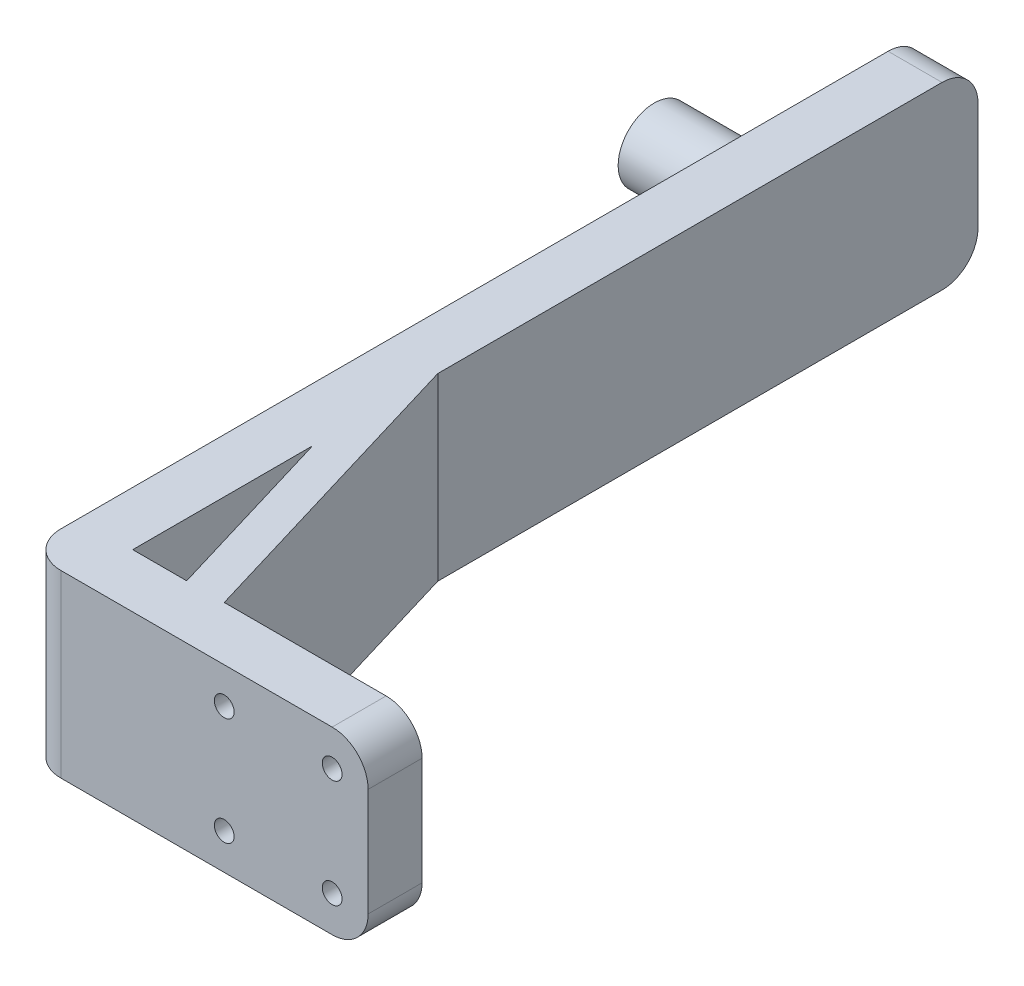
ISO-10303-21;
HEADER;
FILE_DESCRIPTION(('STEP AP214'),'2;1');
FILE_NAME('part.step','',(''),(''),'','','');
FILE_SCHEMA(('AUTOMOTIVE_DESIGN { 1 0 10303 214 1 1 1 1 }'));
ENDSEC;
DATA;
#1=APPLICATION_CONTEXT('core data for automotive mechanical design processes');
#2=APPLICATION_PROTOCOL_DEFINITION('international standard','automotive_design',2000,#1);
#3=PRODUCT_CONTEXT('',#1,'mechanical');
#4=PRODUCT('Part','Part','',(#3));
#5=PRODUCT_RELATED_PRODUCT_CATEGORY('part','',(#4));
#6=PRODUCT_DEFINITION_FORMATION('','',#4);
#7=PRODUCT_DEFINITION_CONTEXT('part definition',#1,'design');
#8=PRODUCT_DEFINITION('design','',#6,#7);
#9=PRODUCT_DEFINITION_SHAPE('','',#8);
#10=(LENGTH_UNIT() NAMED_UNIT(*) SI_UNIT(.MILLI.,.METRE.));
#11=(NAMED_UNIT(*) PLANE_ANGLE_UNIT() SI_UNIT($,.RADIAN.));
#12=(NAMED_UNIT(*) SI_UNIT($,.STERADIAN.) SOLID_ANGLE_UNIT());
#13=UNCERTAINTY_MEASURE_WITH_UNIT(LENGTH_MEASURE(1.E-05),#10,'distance_accuracy_value','');
#14=(GEOMETRIC_REPRESENTATION_CONTEXT(3) GLOBAL_UNCERTAINTY_ASSIGNED_CONTEXT((#13)) GLOBAL_UNIT_ASSIGNED_CONTEXT((#10,
#11,#12)) REPRESENTATION_CONTEXT('',''));
#15=CARTESIAN_POINT('',(0.,0.,0.));
#16=DIRECTION('',(0.,0.,1.));
#17=DIRECTION('',(1.,0.,0.));
#18=AXIS2_PLACEMENT_3D('',#15,#16,#17);
#19=CARTESIAN_POINT('',(15.,50.,0.));
#20=DIRECTION('',(-1.,0.,0.));
#21=DIRECTION('',(0.,0.,1.));
#22=AXIS2_PLACEMENT_3D('',#19,#20,#21);
#23=PLANE('',#22);
#24=DIRECTION('',(0.,0.,-1.));
#25=VECTOR('',#24,1.);
#26=CARTESIAN_POINT('',(15.,0.,0.));
#27=LINE('',#26,#25);
#28=CARTESIAN_POINT('',(15.,0.,-15.));
#29=VERTEX_POINT('',#28);
#30=CARTESIAN_POINT('',(15.,0.,-65.));
#31=VERTEX_POINT('',#30);
#32=EDGE_CURVE('E262',#29,#31,#27,.T.);
#33=ORIENTED_EDGE('',*,*,#32,.T.);
#34=DIRECTION('',(0.,-1.,0.));
#35=VECTOR('',#34,1.);
#36=CARTESIAN_POINT('',(15.,50.,-65.));
#37=LINE('',#36,#35);
#38=CARTESIAN_POINT('',(15.,50.,-65.));
#39=VERTEX_POINT('',#38);
#40=EDGE_CURVE('E190',#39,#31,#37,.T.);
#41=ORIENTED_EDGE('',*,*,#40,.F.);
#42=DIRECTION('',(0.,0.,-1.));
#43=VECTOR('',#42,1.);
#44=CARTESIAN_POINT('',(15.,50.,0.));
#45=LINE('',#44,#43);
#46=CARTESIAN_POINT('',(15.,50.,-15.));
#47=VERTEX_POINT('',#46);
#48=EDGE_CURVE('E160',#47,#39,#45,.T.);
#49=ORIENTED_EDGE('',*,*,#48,.F.);
#50=DIRECTION('',(0.,-1.,0.));
#51=VECTOR('',#50,1.);
#52=CARTESIAN_POINT('',(15.,50.,-15.));
#53=LINE('',#52,#51);
#54=EDGE_CURVE('E176',#47,#29,#53,.T.);
#55=ORIENTED_EDGE('',*,*,#54,.T.);
#56=EDGE_LOOP('',(#33,#41,#49,#55));
#57=FACE_BOUND('',#56,.T.);
#58=ADVANCED_FACE('F41',(#57),#23,.F.);
#59=CARTESIAN_POINT('',(31.651376146789,50.,-9.4954128440367));
#60=DIRECTION('',(0.957826285221152,0.,-0.287347885566345));
#61=DIRECTION('',(-0.287347885566345,0.,-0.957826285221152));
#62=AXIS2_PLACEMENT_3D('',#59,#60,#61);
#63=PLANE('',#62);
#64=DIRECTION('',(0.287347885566345,0.,0.957826285221151));
#65=VECTOR('',#64,1.);
#66=CARTESIAN_POINT('',(31.651376146789,0.,-9.4954128440367));
#67=LINE('',#66,#65);
#68=CARTESIAN_POINT('',(30.,0.,-15.));
#69=VERTEX_POINT('',#68);
#70=EDGE_CURVE('E268',#31,#69,#67,.T.);
#71=ORIENTED_EDGE('',*,*,#70,.T.);
#72=DIRECTION('',(0.,-1.,0.));
#73=VECTOR('',#72,1.);
#74=CARTESIAN_POINT('',(30.,50.,-15.));
#75=LINE('',#74,#73);
#76=CARTESIAN_POINT('',(30.,50.,-15.));
#77=VERTEX_POINT('',#76);
#78=EDGE_CURVE('E180',#77,#69,#75,.T.);
#79=ORIENTED_EDGE('',*,*,#78,.F.);
#80=DIRECTION('',(0.287347885566345,0.,0.957826285221151));
#81=VECTOR('',#80,1.);
#82=CARTESIAN_POINT('',(31.651376146789,50.,-9.4954128440367));
#83=LINE('',#82,#81);
#84=EDGE_CURVE('E258',#39,#77,#83,.T.);
#85=ORIENTED_EDGE('',*,*,#84,.F.);
#86=ORIENTED_EDGE('',*,*,#40,.T.);
#87=EDGE_LOOP('',(#71,#79,#85,#86));
#88=FACE_BOUND('',#87,.T.);
#89=ADVANCED_FACE('F312',(#88),#63,.F.);
#90=CARTESIAN_POINT('',(41.2296389990005,50.,-12.3688916997002));
#91=DIRECTION('',(-0.957826285221151,0.,0.287347885566345));
#92=DIRECTION('',(0.287347885566346,0.,0.957826285221152));
#93=AXIS2_PLACEMENT_3D('',#90,#91,#92);
#94=PLANE('',#93);
#95=DIRECTION('',(-0.287347885566346,0.,-0.957826285221151));
#96=VECTOR('',#95,1.);
#97=CARTESIAN_POINT('',(41.2296389990005,0.,-12.3688916997002));
#98=LINE('',#97,#96);
#99=CARTESIAN_POINT('',(40.4403065089105,0.,-15.));
#100=VERTEX_POINT('',#99);
#101=CARTESIAN_POINT('',(15.,0.,-99.8010216963685));
#102=VERTEX_POINT('',#101);
#103=EDGE_CURVE('E175',#100,#102,#98,.T.);
#104=ORIENTED_EDGE('',*,*,#103,.T.);
#105=DIRECTION('',(0.,-1.,0.));
#106=VECTOR('',#105,1.);
#107=CARTESIAN_POINT('',(15.,50.,-99.8010216963685));
#108=LINE('',#107,#106);
#109=CARTESIAN_POINT('',(15.,50.,-99.8010216963685));
#110=VERTEX_POINT('',#109);
#111=EDGE_CURVE('E151',#110,#102,#108,.T.);
#112=ORIENTED_EDGE('',*,*,#111,.F.);
#113=DIRECTION('',(-0.287347885566346,0.,-0.957826285221151));
#114=VECTOR('',#113,1.);
#115=CARTESIAN_POINT('',(41.2296389990005,50.,-12.3688916997002));
#116=LINE('',#115,#114);
#117=CARTESIAN_POINT('',(40.4403065089105,50.,-15.));
#118=VERTEX_POINT('',#117);
#119=EDGE_CURVE('E158',#118,#110,#116,.T.);
#120=ORIENTED_EDGE('',*,*,#119,.F.);
#121=DIRECTION('',(0.,-1.,0.));
#122=VECTOR('',#121,1.);
#123=CARTESIAN_POINT('',(40.4403065089105,50.,-15.));
#124=LINE('',#123,#122);
#125=EDGE_CURVE('E274',#118,#100,#124,.T.);
#126=ORIENTED_EDGE('',*,*,#125,.T.);
#127=EDGE_LOOP('',(#104,#112,#120,#126));
#128=FACE_BOUND('',#127,.T.);
#129=ADVANCED_FACE('F173',(#128),#94,.F.);
#130=CARTESIAN_POINT('',(15.,0.,-240.));
#131=VERTEX_POINT('',#130);
#132=EDGE_CURVE('E245',#102,#131,#27,.T.);
#133=ORIENTED_EDGE('',*,*,#132,.T.);
#134=CARTESIAN_POINT('',(15.,10.,-240.));
#135=DIRECTION('',(-1.,0.,0.));
#136=DIRECTION('',(0.,0.,1.));
#137=AXIS2_PLACEMENT_3D('',#134,#135,#136);
#138=CIRCLE('',#137,10.);
#139=CARTESIAN_POINT('',(15.,10.,-250.));
#140=VERTEX_POINT('',#139);
#141=EDGE_CURVE('E11',#131,#140,#138,.F.);
#142=ORIENTED_EDGE('',*,*,#141,.T.);
#143=DIRECTION('',(0.,-1.,0.));
#144=VECTOR('',#143,1.);
#145=CARTESIAN_POINT('',(15.,50.,-250.));
#146=LINE('',#145,#144);
#147=CARTESIAN_POINT('',(15.,40.,-250.));
#148=VERTEX_POINT('',#147);
#149=EDGE_CURVE('E177',#148,#140,#146,.T.);
#150=ORIENTED_EDGE('',*,*,#149,.F.);
#151=CARTESIAN_POINT('',(15.,40.,-240.));
#152=DIRECTION('',(-1.,0.,0.));
#153=DIRECTION('',(0.,0.,1.));
#154=AXIS2_PLACEMENT_3D('',#151,#152,#153);
#155=CIRCLE('',#154,10.);
#156=CARTESIAN_POINT('',(15.,50.,-240.));
#157=VERTEX_POINT('',#156);
#158=EDGE_CURVE('E49',#148,#157,#155,.F.);
#159=ORIENTED_EDGE('',*,*,#158,.T.);
#160=EDGE_CURVE('E147',#110,#157,#45,.T.);
#161=ORIENTED_EDGE('',*,*,#160,.F.);
#162=ORIENTED_EDGE('',*,*,#111,.T.);
#163=EDGE_LOOP('',(#133,#142,#150,#159,#161,#162));
#164=FACE_BOUND('',#163,.T.);
#165=ADVANCED_FACE('F149',(#164),#23,.F.);
#166=CARTESIAN_POINT('',(0.,50.,-250.));
#167=DIRECTION('',(0.,0.,1.));
#168=DIRECTION('',(1.,0.,0.));
#169=AXIS2_PLACEMENT_3D('',#166,#167,#168);
#170=PLANE('',#169);
#171=ORIENTED_EDGE('',*,*,#149,.T.);
#172=DIRECTION('',(-1.,0.,0.));
#173=VECTOR('',#172,1.);
#174=CARTESIAN_POINT('',(0.,10.,-250.));
#175=LINE('',#174,#173);
#176=CARTESIAN_POINT('',(0.,10.,-250.));
#177=VERTEX_POINT('',#176);
#178=EDGE_CURVE('E224',#140,#177,#175,.T.);
#179=ORIENTED_EDGE('',*,*,#178,.T.);
#180=DIRECTION('',(0.,-1.,0.));
#181=VECTOR('',#180,1.);
#182=CARTESIAN_POINT('',(0.,50.,-250.));
#183=LINE('',#182,#181);
#184=CARTESIAN_POINT('',(0.,40.,-250.));
#185=VERTEX_POINT('',#184);
#186=EDGE_CURVE('E182',#185,#177,#183,.T.);
#187=ORIENTED_EDGE('',*,*,#186,.F.);
#188=DIRECTION('',(-1.,0.,0.));
#189=VECTOR('',#188,1.);
#190=CARTESIAN_POINT('',(15.,40.,-250.));
#191=LINE('',#190,#189);
#192=EDGE_CURVE('E61',#185,#148,#191,.F.);
#193=ORIENTED_EDGE('',*,*,#192,.T.);
#194=EDGE_LOOP('',(#171,#179,#187,#193));
#195=FACE_BOUND('',#194,.T.);
#196=ADVANCED_FACE('F248',(#195),#170,.F.);
#197=CARTESIAN_POINT('',(0.,50.,0.));
#198=DIRECTION('',(1.,0.,0.));
#199=DIRECTION('',(0.,0.,-1.));
#200=AXIS2_PLACEMENT_3D('',#197,#198,#199);
#201=PLANE('',#200);
#202=CARTESIAN_POINT('',(0.,25.,-210.));
#203=DIRECTION('',(1.,0.,0.));
#204=DIRECTION('',(0.,0.,-1.));
#205=AXIS2_PLACEMENT_3D('',#202,#203,#204);
#206=CIRCLE('',#205,12.5);
#207=CARTESIAN_POINT('',(0.,25.,-222.5));
#208=VERTEX_POINT('',#207);
#209=EDGE_CURVE('E198',#208,#208,#206,.F.);
#210=ORIENTED_EDGE('',*,*,#209,.F.);
#211=EDGE_LOOP('',(#210));
#212=FACE_BOUND('',#211,.T.);
#213=ORIENTED_EDGE('',*,*,#186,.T.);
#214=CARTESIAN_POINT('',(0.,10.,-240.));
#215=DIRECTION('',(1.,0.,0.));
#216=DIRECTION('',(0.,0.,-1.));
#217=AXIS2_PLACEMENT_3D('',#214,#215,#216);
#218=CIRCLE('',#217,10.);
#219=CARTESIAN_POINT('',(0.,0.,-240.));
#220=VERTEX_POINT('',#219);
#221=EDGE_CURVE('E229',#177,#220,#218,.F.);
#222=ORIENTED_EDGE('',*,*,#221,.T.);
#223=DIRECTION('',(0.,0.,1.));
#224=VECTOR('',#223,1.);
#225=CARTESIAN_POINT('',(0.,0.,0.));
#226=LINE('',#225,#224);
#227=CARTESIAN_POINT('',(0.,0.,-10.));
#228=VERTEX_POINT('',#227);
#229=EDGE_CURVE('E234',#220,#228,#226,.T.);
#230=ORIENTED_EDGE('',*,*,#229,.T.);
#231=DIRECTION('',(0.,-1.,0.));
#232=VECTOR('',#231,1.);
#233=CARTESIAN_POINT('',(0.,50.,-10.));
#234=LINE('',#233,#232);
#235=CARTESIAN_POINT('',(0.,50.,-10.));
#236=VERTEX_POINT('',#235);
#237=EDGE_CURVE('E193',#228,#236,#234,.F.);
#238=ORIENTED_EDGE('',*,*,#237,.T.);
#239=DIRECTION('',(0.,0.,1.));
#240=VECTOR('',#239,1.);
#241=CARTESIAN_POINT('',(0.,50.,0.));
#242=LINE('',#241,#240);
#243=CARTESIAN_POINT('',(0.,50.,-240.));
#244=VERTEX_POINT('',#243);
#245=EDGE_CURVE('E157',#244,#236,#242,.T.);
#246=ORIENTED_EDGE('',*,*,#245,.F.);
#247=CARTESIAN_POINT('',(0.,40.,-240.));
#248=DIRECTION('',(1.,0.,0.));
#249=DIRECTION('',(0.,0.,-1.));
#250=AXIS2_PLACEMENT_3D('',#247,#248,#249);
#251=CIRCLE('',#250,10.);
#252=EDGE_CURVE('E227',#244,#185,#251,.F.);
#253=ORIENTED_EDGE('',*,*,#252,.T.);
#254=EDGE_LOOP('',(#213,#222,#230,#238,#246,#253));
#255=FACE_BOUND('',#254,.T.);
#256=ADVANCED_FACE('F233',(#212,#255),#201,.F.);
#257=CARTESIAN_POINT('',(0.,50.,0.));
#258=DIRECTION('',(0.,0.,-1.));
#259=DIRECTION('',(-1.,0.,0.));
#260=AXIS2_PLACEMENT_3D('',#257,#258,#259);
#261=PLANE('',#260);
#262=CARTESIAN_POINT('',(85.4403065089106,40.,0.));
#263=DIRECTION('',(0.,0.,-1.));
#264=DIRECTION('',(-1.,0.,0.));
#265=AXIS2_PLACEMENT_3D('',#262,#263,#264);
#266=CIRCLE('',#265,2.74999999999999);
#267=CARTESIAN_POINT('',(82.6903065089106,40.,0.));
#268=VERTEX_POINT('',#267);
#269=EDGE_CURVE('E457',#268,#268,#266,.T.);
#270=ORIENTED_EDGE('',*,*,#269,.T.);
#271=EDGE_LOOP('',(#270));
#272=FACE_BOUND('',#271,.T.);
#273=CARTESIAN_POINT('',(55.4403065089106,10.,0.));
#274=DIRECTION('',(0.,0.,-1.));
#275=DIRECTION('',(-1.,0.,0.));
#276=AXIS2_PLACEMENT_3D('',#273,#274,#275);
#277=CIRCLE('',#276,2.74999999999999);
#278=CARTESIAN_POINT('',(52.6903065089106,10.,0.));
#279=VERTEX_POINT('',#278);
#280=EDGE_CURVE('E464',#279,#279,#277,.T.);
#281=ORIENTED_EDGE('',*,*,#280,.T.);
#282=EDGE_LOOP('',(#281));
#283=FACE_BOUND('',#282,.T.);
#284=CARTESIAN_POINT('',(85.4403065089106,10.,0.));
#285=DIRECTION('',(0.,0.,-1.));
#286=DIRECTION('',(-1.,0.,0.));
#287=AXIS2_PLACEMENT_3D('',#284,#285,#286);
#288=CIRCLE('',#287,2.74999999999999);
#289=CARTESIAN_POINT('',(82.6903065089106,10.,0.));
#290=VERTEX_POINT('',#289);
#291=EDGE_CURVE('E384',#290,#290,#288,.T.);
#292=ORIENTED_EDGE('',*,*,#291,.T.);
#293=EDGE_LOOP('',(#292));
#294=FACE_BOUND('',#293,.T.);
#295=CARTESIAN_POINT('',(55.4403065089106,40.,0.));
#296=DIRECTION('',(0.,0.,-1.));
#297=DIRECTION('',(-1.,0.,0.));
#298=AXIS2_PLACEMENT_3D('',#295,#296,#297);
#299=CIRCLE('',#298,2.74999999999999);
#300=CARTESIAN_POINT('',(52.6903065089106,40.,0.));
#301=VERTEX_POINT('',#300);
#302=EDGE_CURVE('E261',#301,#301,#299,.T.);
#303=ORIENTED_EDGE('',*,*,#302,.T.);
#304=EDGE_LOOP('',(#303));
#305=FACE_BOUND('',#304,.T.);
#306=DIRECTION('',(1.,0.,0.));
#307=VECTOR('',#306,1.);
#308=CARTESIAN_POINT('',(0.,0.,0.));
#309=LINE('',#308,#307);
#310=CARTESIAN_POINT('',(10.,0.,0.));
#311=VERTEX_POINT('',#310);
#312=CARTESIAN_POINT('',(85.4403065089106,0.,0.));
#313=VERTEX_POINT('',#312);
#314=EDGE_CURVE('E244',#311,#313,#309,.T.);
#315=ORIENTED_EDGE('',*,*,#314,.T.);
#316=CARTESIAN_POINT('',(85.4403065089106,10.,0.));
#317=DIRECTION('',(0.,0.,-1.));
#318=DIRECTION('',(-1.,0.,0.));
#319=AXIS2_PLACEMENT_3D('',#316,#317,#318);
#320=CIRCLE('',#319,10.);
#321=CARTESIAN_POINT('',(95.4403065089106,10.,0.));
#322=VERTEX_POINT('',#321);
#323=EDGE_CURVE('E217',#313,#322,#320,.F.);
#324=ORIENTED_EDGE('',*,*,#323,.T.);
#325=DIRECTION('',(0.,-1.,0.));
#326=VECTOR('',#325,1.);
#327=CARTESIAN_POINT('',(95.4403065089106,50.,0.));
#328=LINE('',#327,#326);
#329=CARTESIAN_POINT('',(95.4403065089106,40.,0.));
#330=VERTEX_POINT('',#329);
#331=EDGE_CURVE('E279',#330,#322,#328,.T.);
#332=ORIENTED_EDGE('',*,*,#331,.F.);
#333=CARTESIAN_POINT('',(85.4403065089106,40.,0.));
#334=DIRECTION('',(0.,0.,-1.));
#335=DIRECTION('',(-1.,0.,0.));
#336=AXIS2_PLACEMENT_3D('',#333,#334,#335);
#337=CIRCLE('',#336,10.);
#338=CARTESIAN_POINT('',(85.4403065089106,50.,0.));
#339=VERTEX_POINT('',#338);
#340=EDGE_CURVE('E215',#330,#339,#337,.F.);
#341=ORIENTED_EDGE('',*,*,#340,.T.);
#342=DIRECTION('',(1.,0.,0.));
#343=VECTOR('',#342,1.);
#344=CARTESIAN_POINT('',(0.,50.,0.));
#345=LINE('',#344,#343);
#346=CARTESIAN_POINT('',(10.,50.,0.));
#347=VERTEX_POINT('',#346);
#348=EDGE_CURVE('E252',#347,#339,#345,.T.);
#349=ORIENTED_EDGE('',*,*,#348,.F.);
#350=DIRECTION('',(0.,-1.,0.));
#351=VECTOR('',#350,1.);
#352=CARTESIAN_POINT('',(10.,50.,0.));
#353=LINE('',#352,#351);
#354=EDGE_CURVE('E186',#347,#311,#353,.T.);
#355=ORIENTED_EDGE('',*,*,#354,.T.);
#356=EDGE_LOOP('',(#315,#324,#332,#341,#349,#355));
#357=FACE_BOUND('',#356,.T.);
#358=ADVANCED_FACE('F295',(#272,#283,#294,#305,#357),#261,.F.);
#359=CARTESIAN_POINT('',(95.4403065089106,50.,0.));
#360=DIRECTION('',(-1.,0.,0.));
#361=DIRECTION('',(0.,0.,1.));
#362=AXIS2_PLACEMENT_3D('',#359,#360,#361);
#363=PLANE('',#362);
#364=ORIENTED_EDGE('',*,*,#331,.T.);
#365=DIRECTION('',(0.,0.,-1.));
#366=VECTOR('',#365,1.);
#367=CARTESIAN_POINT('',(95.4403065089106,10.,0.));
#368=LINE('',#367,#366);
#369=CARTESIAN_POINT('',(95.4403065089106,10.,-15.));
#370=VERTEX_POINT('',#369);
#371=EDGE_CURVE('E204',#322,#370,#368,.T.);
#372=ORIENTED_EDGE('',*,*,#371,.T.);
#373=DIRECTION('',(0.,-1.,0.));
#374=VECTOR('',#373,1.);
#375=CARTESIAN_POINT('',(95.4403065089106,50.,-15.));
#376=LINE('',#375,#374);
#377=CARTESIAN_POINT('',(95.4403065089106,40.,-15.));
#378=VERTEX_POINT('',#377);
#379=EDGE_CURVE('E276',#378,#370,#376,.T.);
#380=ORIENTED_EDGE('',*,*,#379,.F.);
#381=DIRECTION('',(0.,0.,-1.));
#382=VECTOR('',#381,1.);
#383=CARTESIAN_POINT('',(95.4403065089106,40.,0.));
#384=LINE('',#383,#382);
#385=EDGE_CURVE('E202',#378,#330,#384,.F.);
#386=ORIENTED_EDGE('',*,*,#385,.T.);
#387=EDGE_LOOP('',(#364,#372,#380,#386));
#388=FACE_BOUND('',#387,.T.);
#389=ADVANCED_FACE('F284',(#388),#363,.F.);
#390=CARTESIAN_POINT('',(0.,50.,-15.));
#391=DIRECTION('',(0.,0.,1.));
#392=DIRECTION('',(1.,0.,0.));
#393=AXIS2_PLACEMENT_3D('',#390,#391,#392);
#394=PLANE('',#393);
#395=CARTESIAN_POINT('',(85.4403065089106,40.,-15.));
#396=DIRECTION('',(0.,0.,-1.));
#397=DIRECTION('',(-1.,0.,0.));
#398=AXIS2_PLACEMENT_3D('',#395,#396,#397);
#399=CIRCLE('',#398,2.775);
#400=CARTESIAN_POINT('',(82.6653065089106,40.,-15.));
#401=VERTEX_POINT('',#400);
#402=EDGE_CURVE('E370',#401,#401,#399,.T.);
#403=ORIENTED_EDGE('',*,*,#402,.F.);
#404=EDGE_LOOP('',(#403));
#405=FACE_BOUND('',#404,.T.);
#406=CARTESIAN_POINT('',(55.4403065089106,10.,-15.));
#407=DIRECTION('',(0.,0.,-1.));
#408=DIRECTION('',(-1.,0.,0.));
#409=AXIS2_PLACEMENT_3D('',#406,#407,#408);
#410=CIRCLE('',#409,2.775);
#411=CARTESIAN_POINT('',(52.6653065089106,10.,-15.));
#412=VERTEX_POINT('',#411);
#413=EDGE_CURVE('E374',#412,#412,#410,.T.);
#414=ORIENTED_EDGE('',*,*,#413,.F.);
#415=EDGE_LOOP('',(#414));
#416=FACE_BOUND('',#415,.T.);
#417=CARTESIAN_POINT('',(85.4403065089106,10.,-15.));
#418=DIRECTION('',(0.,0.,-1.));
#419=DIRECTION('',(-1.,0.,0.));
#420=AXIS2_PLACEMENT_3D('',#417,#418,#419);
#421=CIRCLE('',#420,2.775);
#422=CARTESIAN_POINT('',(82.6653065089106,10.,-15.));
#423=VERTEX_POINT('',#422);
#424=EDGE_CURVE('E378',#423,#423,#421,.T.);
#425=ORIENTED_EDGE('',*,*,#424,.F.);
#426=EDGE_LOOP('',(#425));
#427=FACE_BOUND('',#426,.T.);
#428=CARTESIAN_POINT('',(55.4403065089106,40.,-15.));
#429=DIRECTION('',(0.,0.,-1.));
#430=DIRECTION('',(-1.,0.,0.));
#431=AXIS2_PLACEMENT_3D('',#428,#429,#430);
#432=CIRCLE('',#431,2.775);
#433=CARTESIAN_POINT('',(52.6653065089106,40.,-15.));
#434=VERTEX_POINT('',#433);
#435=EDGE_CURVE('E381',#434,#434,#432,.T.);
#436=ORIENTED_EDGE('',*,*,#435,.F.);
#437=EDGE_LOOP('',(#436));
#438=FACE_BOUND('',#437,.T.);
#439=ORIENTED_EDGE('',*,*,#379,.T.);
#440=CARTESIAN_POINT('',(85.4403065089106,10.,-15.));
#441=DIRECTION('',(0.,0.,1.));
#442=DIRECTION('',(1.,0.,0.));
#443=AXIS2_PLACEMENT_3D('',#440,#441,#442);
#444=CIRCLE('',#443,10.);
#445=CARTESIAN_POINT('',(85.4403065089106,0.,-15.));
#446=VERTEX_POINT('',#445);
#447=EDGE_CURVE('E209',#370,#446,#444,.F.);
#448=ORIENTED_EDGE('',*,*,#447,.T.);
#449=DIRECTION('',(-1.,0.,0.));
#450=VECTOR('',#449,1.);
#451=CARTESIAN_POINT('',(0.,0.,-15.));
#452=LINE('',#451,#450);
#453=EDGE_CURVE('E266',#446,#100,#452,.T.);
#454=ORIENTED_EDGE('',*,*,#453,.T.);
#455=ORIENTED_EDGE('',*,*,#125,.F.);
#456=DIRECTION('',(-1.,0.,0.));
#457=VECTOR('',#456,1.);
#458=CARTESIAN_POINT('',(0.,50.,-15.));
#459=LINE('',#458,#457);
#460=CARTESIAN_POINT('',(85.4403065089106,50.,-15.));
#461=VERTEX_POINT('',#460);
#462=EDGE_CURVE('E167',#461,#118,#459,.T.);
#463=ORIENTED_EDGE('',*,*,#462,.F.);
#464=CARTESIAN_POINT('',(85.4403065089106,40.,-15.));
#465=DIRECTION('',(0.,0.,1.));
#466=DIRECTION('',(1.,0.,0.));
#467=AXIS2_PLACEMENT_3D('',#464,#465,#466);
#468=CIRCLE('',#467,10.);
#469=EDGE_CURVE('E207',#461,#378,#468,.F.);
#470=ORIENTED_EDGE('',*,*,#469,.T.);
#471=EDGE_LOOP('',(#439,#448,#454,#455,#463,#470));
#472=FACE_BOUND('',#471,.T.);
#473=ADVANCED_FACE('F294',(#405,#416,#427,#438,#472),#394,.F.);
#474=EDGE_CURVE('E171',#69,#29,#452,.T.);
#475=ORIENTED_EDGE('',*,*,#474,.T.);
#476=ORIENTED_EDGE('',*,*,#54,.F.);
#477=EDGE_CURVE('E257',#77,#47,#459,.T.);
#478=ORIENTED_EDGE('',*,*,#477,.F.);
#479=ORIENTED_EDGE('',*,*,#78,.T.);
#480=EDGE_LOOP('',(#475,#476,#478,#479));
#481=FACE_BOUND('',#480,.T.);
#482=ADVANCED_FACE('F348',(#481),#394,.F.);
#483=CARTESIAN_POINT('',(0.,50.,0.));
#484=DIRECTION('',(0.,1.,0.));
#485=DIRECTION('',(0.,0.,1.));
#486=AXIS2_PLACEMENT_3D('',#483,#484,#485);
#487=PLANE('',#486);
#488=ORIENTED_EDGE('',*,*,#348,.T.);
#489=DIRECTION('',(0.,0.,-1.));
#490=VECTOR('',#489,1.);
#491=CARTESIAN_POINT('',(85.4403065089106,50.,-15.));
#492=LINE('',#491,#490);
#493=EDGE_CURVE('E221',#339,#461,#492,.T.);
#494=ORIENTED_EDGE('',*,*,#493,.T.);
#495=ORIENTED_EDGE('',*,*,#462,.T.);
#496=ORIENTED_EDGE('',*,*,#119,.T.);
#497=ORIENTED_EDGE('',*,*,#160,.T.);
#498=DIRECTION('',(-1.,0.,0.));
#499=VECTOR('',#498,1.);
#500=CARTESIAN_POINT('',(0.,50.,-240.));
#501=LINE('',#500,#499);
#502=EDGE_CURVE('E219',#157,#244,#501,.T.);
#503=ORIENTED_EDGE('',*,*,#502,.T.);
#504=ORIENTED_EDGE('',*,*,#245,.T.);
#505=CARTESIAN_POINT('',(10.,50.,-10.));
#506=DIRECTION('',(0.,1.,0.));
#507=DIRECTION('',(0.,0.,1.));
#508=AXIS2_PLACEMENT_3D('',#505,#506,#507);
#509=CIRCLE('',#508,10.);
#510=EDGE_CURVE('E196',#236,#347,#509,.T.);
#511=ORIENTED_EDGE('',*,*,#510,.T.);
#512=EDGE_LOOP('',(#488,#494,#495,#496,#497,#503,#504,#511));
#513=FACE_BOUND('',#512,.T.);
#514=ORIENTED_EDGE('',*,*,#48,.T.);
#515=ORIENTED_EDGE('',*,*,#84,.T.);
#516=ORIENTED_EDGE('',*,*,#477,.T.);
#517=EDGE_LOOP('',(#514,#515,#516));
#518=FACE_BOUND('',#517,.T.);
#519=ADVANCED_FACE('F163',(#513,#518),#487,.T.);
#520=CARTESIAN_POINT('',(0.,0.,0.));
#521=DIRECTION('',(0.,1.,0.));
#522=DIRECTION('',(0.,0.,1.));
#523=AXIS2_PLACEMENT_3D('',#520,#521,#522);
#524=PLANE('',#523);
#525=ORIENTED_EDGE('',*,*,#453,.F.);
#526=DIRECTION('',(0.,0.,-1.));
#527=VECTOR('',#526,1.);
#528=CARTESIAN_POINT('',(85.4403065089106,0.,0.));
#529=LINE('',#528,#527);
#530=EDGE_CURVE('E213',#446,#313,#529,.F.);
#531=ORIENTED_EDGE('',*,*,#530,.T.);
#532=ORIENTED_EDGE('',*,*,#314,.F.);
#533=CARTESIAN_POINT('',(10.,0.,-10.));
#534=DIRECTION('',(0.,1.,0.));
#535=DIRECTION('',(0.,0.,1.));
#536=AXIS2_PLACEMENT_3D('',#533,#534,#535);
#537=CIRCLE('',#536,10.);
#538=EDGE_CURVE('E189',#311,#228,#537,.F.);
#539=ORIENTED_EDGE('',*,*,#538,.T.);
#540=ORIENTED_EDGE('',*,*,#229,.F.);
#541=DIRECTION('',(-1.,0.,0.));
#542=VECTOR('',#541,1.);
#543=CARTESIAN_POINT('',(0.,0.,-240.));
#544=LINE('',#543,#542);
#545=EDGE_CURVE('E211',#220,#131,#544,.F.);
#546=ORIENTED_EDGE('',*,*,#545,.T.);
#547=ORIENTED_EDGE('',*,*,#132,.F.);
#548=ORIENTED_EDGE('',*,*,#103,.F.);
#549=EDGE_LOOP('',(#525,#531,#532,#539,#540,#546,#547,#548));
#550=FACE_BOUND('',#549,.T.);
#551=ORIENTED_EDGE('',*,*,#32,.F.);
#552=ORIENTED_EDGE('',*,*,#474,.F.);
#553=ORIENTED_EDGE('',*,*,#70,.F.);
#554=EDGE_LOOP('',(#551,#552,#553));
#555=FACE_BOUND('',#554,.T.);
#556=ADVANCED_FACE('F240',(#550,#555),#524,.F.);
#557=CARTESIAN_POINT('',(10.,50.,-10.));
#558=DIRECTION('',(0.,-1.,0.));
#559=DIRECTION('',(0.,0.,-1.));
#560=AXIS2_PLACEMENT_3D('',#557,#558,#559);
#561=CYLINDRICAL_SURFACE('',#560,10.);
#562=ORIENTED_EDGE('',*,*,#510,.F.);
#563=ORIENTED_EDGE('',*,*,#237,.F.);
#564=ORIENTED_EDGE('',*,*,#538,.F.);
#565=ORIENTED_EDGE('',*,*,#354,.F.);
#566=EDGE_LOOP('',(#562,#563,#564,#565));
#567=FACE_BOUND('',#566,.T.);
#568=ADVANCED_FACE('F299',(#567),#561,.T.);
#569=CARTESIAN_POINT('',(55.4403065089106,40.,-15.));
#570=DIRECTION('',(0.,0.,-1.));
#571=DIRECTION('',(-1.,0.,0.));
#572=AXIS2_PLACEMENT_3D('',#569,#570,#571);
#573=CYLINDRICAL_SURFACE('',#572,2.74999999999999);
#574=ORIENTED_EDGE('',*,*,#302,.F.);
#575=EDGE_LOOP('',(#574));
#576=FACE_BOUND('',#575,.T.);
#577=CARTESIAN_POINT('',(55.4403065089106,40.,-14.975));
#578=DIRECTION('',(0.,0.,-1.));
#579=DIRECTION('',(-1.,0.,0.));
#580=AXIS2_PLACEMENT_3D('',#577,#578,#579);
#581=CIRCLE('',#580,2.74999999999999);
#582=CARTESIAN_POINT('',(52.6903065089106,40.,-14.975));
#583=VERTEX_POINT('',#582);
#584=EDGE_CURVE('E383',#583,#583,#581,.T.);
#585=ORIENTED_EDGE('',*,*,#584,.T.);
#586=EDGE_LOOP('',(#585));
#587=FACE_BOUND('',#586,.T.);
#588=ADVANCED_FACE('F336',(#576,#587),#573,.F.);
#589=CARTESIAN_POINT('',(55.4403065089106,40.,-15.));
#590=DIRECTION('',(0.,0.,-1.));
#591=DIRECTION('',(-1.,0.,0.));
#592=AXIS2_PLACEMENT_3D('',#589,#590,#591);
#593=CONICAL_SURFACE('',#592,2.775,0.785398163397691);
#594=ORIENTED_EDGE('',*,*,#584,.F.);
#595=EDGE_LOOP('',(#594));
#596=FACE_BOUND('',#595,.T.);
#597=ORIENTED_EDGE('',*,*,#435,.T.);
#598=EDGE_LOOP('',(#597));
#599=FACE_BOUND('',#598,.T.);
#600=ADVANCED_FACE('F340',(#596,#599),#593,.F.);
#601=CARTESIAN_POINT('',(85.4403065089106,10.,-15.));
#602=DIRECTION('',(0.,0.,-1.));
#603=DIRECTION('',(-1.,0.,0.));
#604=AXIS2_PLACEMENT_3D('',#601,#602,#603);
#605=CYLINDRICAL_SURFACE('',#604,2.74999999999999);
#606=ORIENTED_EDGE('',*,*,#291,.F.);
#607=EDGE_LOOP('',(#606));
#608=FACE_BOUND('',#607,.T.);
#609=CARTESIAN_POINT('',(85.4403065089106,10.,-14.975));
#610=DIRECTION('',(0.,0.,-1.));
#611=DIRECTION('',(-1.,0.,0.));
#612=AXIS2_PLACEMENT_3D('',#609,#610,#611);
#613=CIRCLE('',#612,2.74999999999999);
#614=CARTESIAN_POINT('',(82.6903065089106,10.,-14.975));
#615=VERTEX_POINT('',#614);
#616=EDGE_CURVE('E389',#615,#615,#613,.T.);
#617=ORIENTED_EDGE('',*,*,#616,.T.);
#618=EDGE_LOOP('',(#617));
#619=FACE_BOUND('',#618,.T.);
#620=ADVANCED_FACE('F400',(#608,#619),#605,.F.);
#621=CARTESIAN_POINT('',(85.4403065089106,10.,-15.));
#622=DIRECTION('',(0.,0.,-1.));
#623=DIRECTION('',(-1.,0.,0.));
#624=AXIS2_PLACEMENT_3D('',#621,#622,#623);
#625=CONICAL_SURFACE('',#624,2.775,0.785398163397691);
#626=ORIENTED_EDGE('',*,*,#616,.F.);
#627=EDGE_LOOP('',(#626));
#628=FACE_BOUND('',#627,.T.);
#629=ORIENTED_EDGE('',*,*,#424,.T.);
#630=EDGE_LOOP('',(#629));
#631=FACE_BOUND('',#630,.T.);
#632=ADVANCED_FACE('F405',(#628,#631),#625,.F.);
#633=CARTESIAN_POINT('',(55.4403065089106,10.,-15.));
#634=DIRECTION('',(0.,0.,-1.));
#635=DIRECTION('',(-1.,0.,0.));
#636=AXIS2_PLACEMENT_3D('',#633,#634,#635);
#637=CYLINDRICAL_SURFACE('',#636,2.74999999999999);
#638=ORIENTED_EDGE('',*,*,#280,.F.);
#639=EDGE_LOOP('',(#638));
#640=FACE_BOUND('',#639,.T.);
#641=CARTESIAN_POINT('',(55.4403065089106,10.,-14.975));
#642=DIRECTION('',(0.,0.,-1.));
#643=DIRECTION('',(-1.,0.,0.));
#644=AXIS2_PLACEMENT_3D('',#641,#642,#643);
#645=CIRCLE('',#644,2.74999999999999);
#646=CARTESIAN_POINT('',(52.6903065089106,10.,-14.975));
#647=VERTEX_POINT('',#646);
#648=EDGE_CURVE('E461',#647,#647,#645,.T.);
#649=ORIENTED_EDGE('',*,*,#648,.T.);
#650=EDGE_LOOP('',(#649));
#651=FACE_BOUND('',#650,.T.);
#652=ADVANCED_FACE('F411',(#640,#651),#637,.F.);
#653=CARTESIAN_POINT('',(55.4403065089106,10.,-15.));
#654=DIRECTION('',(0.,0.,-1.));
#655=DIRECTION('',(-1.,0.,0.));
#656=AXIS2_PLACEMENT_3D('',#653,#654,#655);
#657=CONICAL_SURFACE('',#656,2.775,0.785398163397691);
#658=ORIENTED_EDGE('',*,*,#648,.F.);
#659=EDGE_LOOP('',(#658));
#660=FACE_BOUND('',#659,.T.);
#661=ORIENTED_EDGE('',*,*,#413,.T.);
#662=EDGE_LOOP('',(#661));
#663=FACE_BOUND('',#662,.T.);
#664=ADVANCED_FACE('F415',(#660,#663),#657,.F.);
#665=CARTESIAN_POINT('',(85.4403065089106,40.,-15.));
#666=DIRECTION('',(0.,0.,-1.));
#667=DIRECTION('',(-1.,0.,0.));
#668=AXIS2_PLACEMENT_3D('',#665,#666,#667);
#669=CYLINDRICAL_SURFACE('',#668,2.74999999999999);
#670=ORIENTED_EDGE('',*,*,#269,.F.);
#671=EDGE_LOOP('',(#670));
#672=FACE_BOUND('',#671,.T.);
#673=CARTESIAN_POINT('',(85.4403065089106,40.,-14.975));
#674=DIRECTION('',(0.,0.,-1.));
#675=DIRECTION('',(-1.,0.,0.));
#676=AXIS2_PLACEMENT_3D('',#673,#674,#675);
#677=CIRCLE('',#676,2.74999999999999);
#678=CARTESIAN_POINT('',(82.6903065089106,40.,-14.975));
#679=VERTEX_POINT('',#678);
#680=EDGE_CURVE('E454',#679,#679,#677,.T.);
#681=ORIENTED_EDGE('',*,*,#680,.T.);
#682=EDGE_LOOP('',(#681));
#683=FACE_BOUND('',#682,.T.);
#684=ADVANCED_FACE('F419',(#672,#683),#669,.F.);
#685=CARTESIAN_POINT('',(85.4403065089106,40.,-15.));
#686=DIRECTION('',(0.,0.,-1.));
#687=DIRECTION('',(-1.,0.,0.));
#688=AXIS2_PLACEMENT_3D('',#685,#686,#687);
#689=CONICAL_SURFACE('',#688,2.775,0.785398163397691);
#690=ORIENTED_EDGE('',*,*,#680,.F.);
#691=EDGE_LOOP('',(#690));
#692=FACE_BOUND('',#691,.T.);
#693=ORIENTED_EDGE('',*,*,#402,.T.);
#694=EDGE_LOOP('',(#693));
#695=FACE_BOUND('',#694,.T.);
#696=ADVANCED_FACE('F423',(#692,#695),#689,.F.);
#697=CARTESIAN_POINT('',(-5.00000000000002,25.,-210.));
#698=DIRECTION('',(1.,0.,0.));
#699=DIRECTION('',(0.,0.,-1.));
#700=AXIS2_PLACEMENT_3D('',#697,#698,#699);
#701=CYLINDRICAL_SURFACE('',#700,12.5);
#702=CARTESIAN_POINT('',(-5.00000000000002,25.,-210.));
#703=DIRECTION('',(-1.,0.,0.));
#704=DIRECTION('',(0.,0.,1.));
#705=AXIS2_PLACEMENT_3D('',#702,#703,#704);
#706=CIRCLE('',#705,12.5);
#707=CARTESIAN_POINT('',(-5.00000000000002,25.,-197.5));
#708=VERTEX_POINT('',#707);
#709=EDGE_CURVE('E446',#708,#708,#706,.T.);
#710=ORIENTED_EDGE('',*,*,#709,.F.);
#711=EDGE_LOOP('',(#710));
#712=FACE_BOUND('',#711,.T.);
#713=ORIENTED_EDGE('',*,*,#209,.T.);
#714=EDGE_LOOP('',(#713));
#715=FACE_BOUND('',#714,.T.);
#716=ADVANCED_FACE('F427',(#712,#715),#701,.T.);
#717=CARTESIAN_POINT('',(-5.00000000000002,25.,-210.));
#718=DIRECTION('',(-1.,0.,0.));
#719=DIRECTION('',(0.,0.,1.));
#720=AXIS2_PLACEMENT_3D('',#717,#718,#719);
#721=PLANE('',#720);
#722=CARTESIAN_POINT('',(-5.00000000000002,25.,-210.));
#723=DIRECTION('',(-1.,0.,0.));
#724=DIRECTION('',(0.,0.,1.));
#725=AXIS2_PLACEMENT_3D('',#722,#723,#724);
#726=CIRCLE('',#725,10.05);
#727=CARTESIAN_POINT('',(-5.00000000000002,25.,-199.95));
#728=VERTEX_POINT('',#727);
#729=EDGE_CURVE('E201',#728,#728,#726,.T.);
#730=ORIENTED_EDGE('',*,*,#729,.F.);
#731=EDGE_LOOP('',(#730));
#732=FACE_BOUND('',#731,.T.);
#733=ORIENTED_EDGE('',*,*,#709,.T.);
#734=EDGE_LOOP('',(#733));
#735=FACE_BOUND('',#734,.T.);
#736=ADVANCED_FACE('F431',(#732,#735),#721,.T.);
#737=CARTESIAN_POINT('',(-35.,25.,-210.));
#738=DIRECTION('',(1.,0.,0.));
#739=DIRECTION('',(0.,0.,-1.));
#740=AXIS2_PLACEMENT_3D('',#737,#738,#739);
#741=CYLINDRICAL_SURFACE('',#740,10.05);
#742=CARTESIAN_POINT('',(-35.,25.,-210.));
#743=DIRECTION('',(-1.,0.,0.));
#744=DIRECTION('',(0.,0.,1.));
#745=AXIS2_PLACEMENT_3D('',#742,#743,#744);
#746=CIRCLE('',#745,10.05);
#747=CARTESIAN_POINT('',(-35.,25.,-199.95));
#748=VERTEX_POINT('',#747);
#749=EDGE_CURVE('E445',#748,#748,#746,.T.);
#750=ORIENTED_EDGE('',*,*,#749,.F.);
#751=EDGE_LOOP('',(#750));
#752=FACE_BOUND('',#751,.T.);
#753=ORIENTED_EDGE('',*,*,#729,.T.);
#754=EDGE_LOOP('',(#753));
#755=FACE_BOUND('',#754,.T.);
#756=ADVANCED_FACE('F435',(#752,#755),#741,.T.);
#757=CARTESIAN_POINT('',(-35.,25.,-210.));
#758=DIRECTION('',(-1.,0.,0.));
#759=DIRECTION('',(0.,0.,1.));
#760=AXIS2_PLACEMENT_3D('',#757,#758,#759);
#761=PLANE('',#760);
#762=ORIENTED_EDGE('',*,*,#749,.T.);
#763=EDGE_LOOP('',(#762));
#764=FACE_BOUND('',#763,.T.);
#765=ADVANCED_FACE('F309',(#764),#761,.T.);
#766=CARTESIAN_POINT('',(85.4403065089106,10.,0.));
#767=DIRECTION('',(0.,0.,-1.));
#768=DIRECTION('',(-1.,0.,0.));
#769=AXIS2_PLACEMENT_3D('',#766,#767,#768);
#770=CYLINDRICAL_SURFACE('',#769,10.);
#771=ORIENTED_EDGE('',*,*,#323,.F.);
#772=ORIENTED_EDGE('',*,*,#530,.F.);
#773=ORIENTED_EDGE('',*,*,#447,.F.);
#774=ORIENTED_EDGE('',*,*,#371,.F.);
#775=EDGE_LOOP('',(#771,#772,#773,#774));
#776=FACE_BOUND('',#775,.T.);
#777=ADVANCED_FACE('F291',(#776),#770,.T.);
#778=CARTESIAN_POINT('',(85.4403065089106,40.,0.));
#779=DIRECTION('',(0.,0.,1.));
#780=DIRECTION('',(1.,0.,0.));
#781=AXIS2_PLACEMENT_3D('',#778,#779,#780);
#782=CYLINDRICAL_SURFACE('',#781,10.);
#783=ORIENTED_EDGE('',*,*,#340,.F.);
#784=ORIENTED_EDGE('',*,*,#385,.F.);
#785=ORIENTED_EDGE('',*,*,#469,.F.);
#786=ORIENTED_EDGE('',*,*,#493,.F.);
#787=EDGE_LOOP('',(#783,#784,#785,#786));
#788=FACE_BOUND('',#787,.T.);
#789=ADVANCED_FACE('F302',(#788),#782,.T.);
#790=CARTESIAN_POINT('',(0.,10.,-240.));
#791=DIRECTION('',(-1.,0.,0.));
#792=DIRECTION('',(0.,0.,1.));
#793=AXIS2_PLACEMENT_3D('',#790,#791,#792);
#794=CYLINDRICAL_SURFACE('',#793,10.);
#795=ORIENTED_EDGE('',*,*,#141,.F.);
#796=ORIENTED_EDGE('',*,*,#545,.F.);
#797=ORIENTED_EDGE('',*,*,#221,.F.);
#798=ORIENTED_EDGE('',*,*,#178,.F.);
#799=EDGE_LOOP('',(#795,#796,#797,#798));
#800=FACE_BOUND('',#799,.T.);
#801=ADVANCED_FACE('F247',(#800),#794,.T.);
#802=CARTESIAN_POINT('',(0.,40.,-240.));
#803=DIRECTION('',(1.,0.,0.));
#804=DIRECTION('',(0.,0.,-1.));
#805=AXIS2_PLACEMENT_3D('',#802,#803,#804);
#806=CYLINDRICAL_SURFACE('',#805,10.);
#807=ORIENTED_EDGE('',*,*,#158,.F.);
#808=ORIENTED_EDGE('',*,*,#192,.F.);
#809=ORIENTED_EDGE('',*,*,#252,.F.);
#810=ORIENTED_EDGE('',*,*,#502,.F.);
#811=EDGE_LOOP('',(#807,#808,#809,#810));
#812=FACE_BOUND('',#811,.T.);
#813=ADVANCED_FACE('F43',(#812),#806,.T.);
#814=CLOSED_SHELL('',(#58,#89,#129,#165,#196,#256,#358,#389,#473,#482,#519,#556,#568,#588,#600,
#620,#632,#652,#664,#684,#696,#716,#736,#756,#765,#777,#789,#801,#813));
#815=MANIFOLD_SOLID_BREP('B2',#814);
#816=ADVANCED_BREP_SHAPE_REPRESENTATION('',(#18,#815),#14);
#817=SHAPE_DEFINITION_REPRESENTATION(#9,#816);
ENDSEC;
END-ISO-10303-21;
